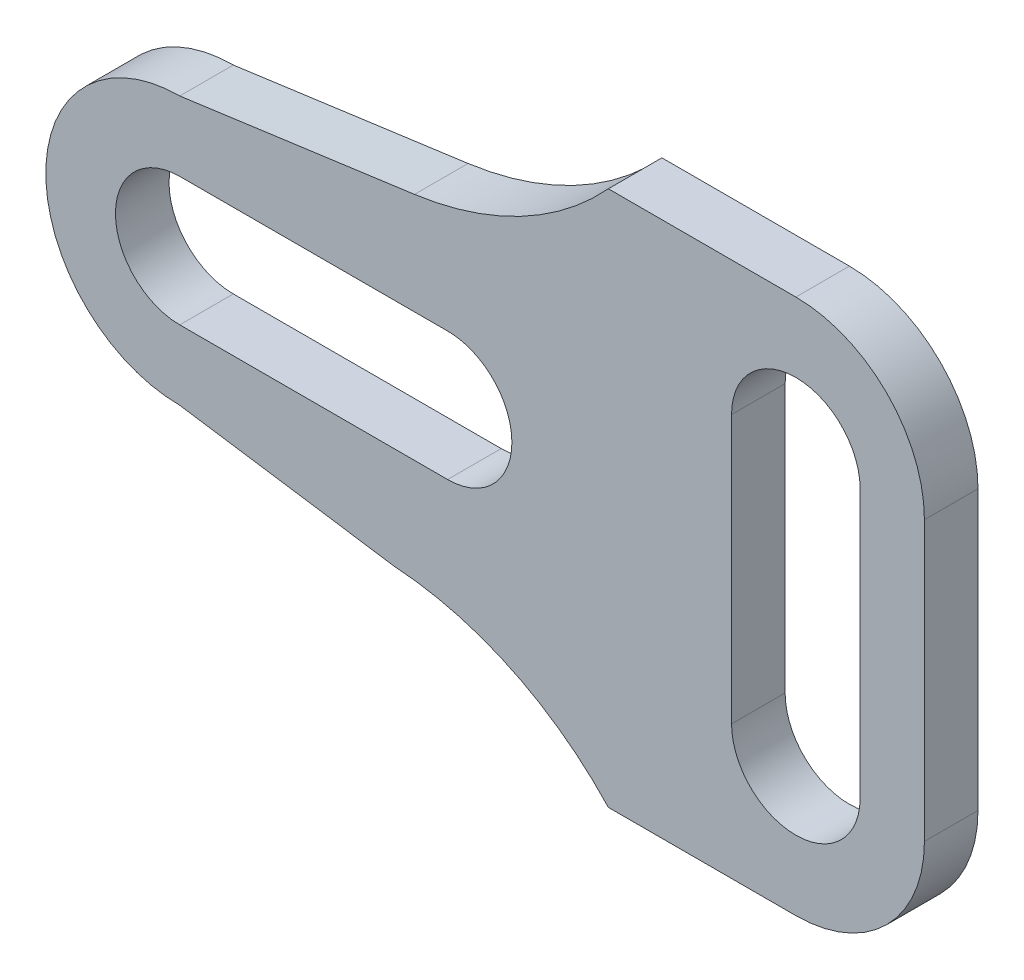
ISO-10303-21;
HEADER;
FILE_DESCRIPTION(('STEP AP214'),'2;1');
FILE_NAME('part.step','',(''),(''),'','','');
FILE_SCHEMA(('AUTOMOTIVE_DESIGN { 1 0 10303 214 1 1 1 1 }'));
ENDSEC;
DATA;
#1=APPLICATION_CONTEXT('core data for automotive mechanical design processes');
#2=APPLICATION_PROTOCOL_DEFINITION('international standard','automotive_design',2000,#1);
#3=PRODUCT_CONTEXT('',#1,'mechanical');
#4=PRODUCT('Part','Part','',(#3));
#5=PRODUCT_RELATED_PRODUCT_CATEGORY('part','',(#4));
#6=PRODUCT_DEFINITION_FORMATION('','',#4);
#7=PRODUCT_DEFINITION_CONTEXT('part definition',#1,'design');
#8=PRODUCT_DEFINITION('design','',#6,#7);
#9=PRODUCT_DEFINITION_SHAPE('','',#8);
#10=(LENGTH_UNIT() NAMED_UNIT(*) SI_UNIT(.MILLI.,.METRE.));
#11=(NAMED_UNIT(*) PLANE_ANGLE_UNIT() SI_UNIT($,.RADIAN.));
#12=(NAMED_UNIT(*) SI_UNIT($,.STERADIAN.) SOLID_ANGLE_UNIT());
#13=UNCERTAINTY_MEASURE_WITH_UNIT(LENGTH_MEASURE(1.E-05),#10,'distance_accuracy_value','');
#14=(GEOMETRIC_REPRESENTATION_CONTEXT(3) GLOBAL_UNCERTAINTY_ASSIGNED_CONTEXT((#13)) GLOBAL_UNIT_ASSIGNED_CONTEXT((#10,
#11,#12)) REPRESENTATION_CONTEXT('',''));
#15=CARTESIAN_POINT('',(0.,0.,0.));
#16=DIRECTION('',(0.,0.,1.));
#17=DIRECTION('',(1.,0.,0.));
#18=AXIS2_PLACEMENT_3D('',#15,#16,#17);
#19=CARTESIAN_POINT('',(-396.594977986043,555.770244626776,50.));
#20=DIRECTION('',(0.,0.,1.));
#21=DIRECTION('',(1.,0.,0.));
#22=AXIS2_PLACEMENT_3D('',#19,#20,#21);
#23=PLANE('',#22);
#24=CARTESIAN_POINT('',(-396.594977986043,555.770244626776,50.));
#25=DIRECTION('',(0.,0.,-1.));
#26=DIRECTION('',(1.,0.,0.));
#27=AXIS2_PLACEMENT_3D('',#24,#25,#26);
#28=CIRCLE('',#27,300.);
#29=CARTESIAN_POINT('',(-175.,353.543476538659,50.));
#30=VERTEX_POINT('',#29);
#31=CARTESIAN_POINT('',(-355.897946990004,258.543476538659,50.));
#32=VERTEX_POINT('',#31);
#33=EDGE_CURVE('E225',#30,#32,#28,.T.);
#34=ORIENTED_EDGE('',*,*,#33,.T.);
#35=DIRECTION('',(-0.990755893627058,-0.135656769986796,0.));
#36=VECTOR('',#35,1.);
#37=CARTESIAN_POINT('',(-575.,228.543476538659,50.));
#38=LINE('',#37,#36);
#39=CARTESIAN_POINT('',(-575.,228.543476538659,50.));
#40=VERTEX_POINT('',#39);
#41=EDGE_CURVE('E228',#32,#40,#38,.T.);
#42=ORIENTED_EDGE('',*,*,#41,.T.);
#43=CARTESIAN_POINT('',(-575.,103.543476538659,50.));
#44=DIRECTION('',(0.,0.,1.));
#45=DIRECTION('',(1.,0.,0.));
#46=AXIS2_PLACEMENT_3D('',#43,#44,#45);
#47=CIRCLE('',#46,125.);
#48=CARTESIAN_POINT('',(-575.,-21.4565234613415,50.));
#49=VERTEX_POINT('',#48);
#50=EDGE_CURVE('E231',#40,#49,#47,.T.);
#51=ORIENTED_EDGE('',*,*,#50,.T.);
#52=DIRECTION('',(0.988936352868298,-0.148340452930245,0.));
#53=VECTOR('',#52,1.);
#54=CARTESIAN_POINT('',(-575.,-21.4565234613415,50.));
#55=LINE('',#54,#53);
#56=CARTESIAN_POINT('',(-375.,-51.4565234613414,50.));
#57=VERTEX_POINT('',#56);
#58=EDGE_CURVE('E233',#49,#57,#55,.T.);
#59=ORIENTED_EDGE('',*,*,#58,.T.);
#60=CARTESIAN_POINT('',(-394.632050519389,-350.813471923214,50.));
#61=DIRECTION('',(0.,0.,-1.));
#62=DIRECTION('',(-1.,0.,0.));
#63=AXIS2_PLACEMENT_3D('',#60,#61,#62);
#64=CIRCLE('',#63,300.);
#65=CARTESIAN_POINT('',(-175.,-146.456523461341,50.));
#66=VERTEX_POINT('',#65);
#67=EDGE_CURVE('E235',#57,#66,#64,.T.);
#68=ORIENTED_EDGE('',*,*,#67,.T.);
#69=DIRECTION('',(1.,0.,0.));
#70=VECTOR('',#69,1.);
#71=CARTESIAN_POINT('',(0.,-146.456523461341,50.));
#72=LINE('',#71,#70);
#73=CARTESIAN_POINT('',(0.,-146.456523461341,50.));
#74=VERTEX_POINT('',#73);
#75=EDGE_CURVE('E237',#66,#74,#72,.T.);
#76=ORIENTED_EDGE('',*,*,#75,.T.);
#77=CARTESIAN_POINT('',(0.,-26.4565234613414,50.));
#78=DIRECTION('',(0.,0.,1.));
#79=DIRECTION('',(1.,0.,0.));
#80=AXIS2_PLACEMENT_3D('',#77,#78,#79);
#81=CIRCLE('',#80,120.);
#82=CARTESIAN_POINT('',(120.,-26.4565234613414,50.));
#83=VERTEX_POINT('',#82);
#84=EDGE_CURVE('E239',#74,#83,#81,.T.);
#85=ORIENTED_EDGE('',*,*,#84,.T.);
#86=DIRECTION('',(0.,1.,0.));
#87=VECTOR('',#86,1.);
#88=CARTESIAN_POINT('',(120.,233.543476538659,50.));
#89=LINE('',#88,#87);
#90=CARTESIAN_POINT('',(120.,233.543476538659,50.));
#91=VERTEX_POINT('',#90);
#92=EDGE_CURVE('E241',#83,#91,#89,.T.);
#93=ORIENTED_EDGE('',*,*,#92,.T.);
#94=CARTESIAN_POINT('',(0.,233.543476538659,50.));
#95=DIRECTION('',(0.,0.,1.));
#96=DIRECTION('',(1.,0.,0.));
#97=AXIS2_PLACEMENT_3D('',#94,#95,#96);
#98=CIRCLE('',#97,120.);
#99=CARTESIAN_POINT('',(0.,353.543476538659,50.));
#100=VERTEX_POINT('',#99);
#101=EDGE_CURVE('E243',#91,#100,#98,.T.);
#102=ORIENTED_EDGE('',*,*,#101,.T.);
#103=DIRECTION('',(-1.,0.,0.));
#104=VECTOR('',#103,1.);
#105=CARTESIAN_POINT('',(-175.,353.543476538659,50.));
#106=LINE('',#105,#104);
#107=EDGE_CURVE('E245',#100,#30,#106,.T.);
#108=ORIENTED_EDGE('',*,*,#107,.T.);
#109=EDGE_LOOP('',(#34,#42,#51,#59,#68,#76,#85,#93,#102,#108));
#110=FACE_BOUND('',#109,.T.);
#111=DIRECTION('',(0.,-1.,0.));
#112=VECTOR('',#111,1.);
#113=CARTESIAN_POINT('',(-60.0000000000001,228.543476538659,50.));
#114=LINE('',#113,#112);
#115=CARTESIAN_POINT('',(-60.0000000000001,228.543476538659,50.));
#116=VERTEX_POINT('',#115);
#117=CARTESIAN_POINT('',(-60.,-21.4565234613414,50.));
#118=VERTEX_POINT('',#117);
#119=EDGE_CURVE('E196',#116,#118,#114,.T.);
#120=ORIENTED_EDGE('',*,*,#119,.F.);
#121=CARTESIAN_POINT('',(0.,228.543476538659,50.));
#122=DIRECTION('',(0.,0.,1.));
#123=DIRECTION('',(1.,0.,0.));
#124=AXIS2_PLACEMENT_3D('',#121,#122,#123);
#125=CIRCLE('',#124,60.0000000000001);
#126=CARTESIAN_POINT('',(60.,228.543476538659,50.));
#127=VERTEX_POINT('',#126);
#128=EDGE_CURVE('E194',#127,#116,#125,.T.);
#129=ORIENTED_EDGE('',*,*,#128,.F.);
#130=DIRECTION('',(0.,1.,0.));
#131=VECTOR('',#130,1.);
#132=CARTESIAN_POINT('',(60.,228.543476538659,50.));
#133=LINE('',#132,#131);
#134=CARTESIAN_POINT('',(60.0000000000001,-21.4565234613414,50.));
#135=VERTEX_POINT('',#134);
#136=EDGE_CURVE('E202',#135,#127,#133,.T.);
#137=ORIENTED_EDGE('',*,*,#136,.F.);
#138=CARTESIAN_POINT('',(0.,-21.4565234613414,50.));
#139=DIRECTION('',(0.,0.,1.));
#140=DIRECTION('',(1.,0.,0.));
#141=AXIS2_PLACEMENT_3D('',#138,#139,#140);
#142=CIRCLE('',#141,60.);
#143=EDGE_CURVE('E199',#118,#135,#142,.T.);
#144=ORIENTED_EDGE('',*,*,#143,.F.);
#145=EDGE_LOOP('',(#120,#129,#137,#144));
#146=FACE_BOUND('',#145,.T.);
#147=DIRECTION('',(-1.,0.,0.));
#148=VECTOR('',#147,1.);
#149=CARTESIAN_POINT('',(-325.,163.543476538659,50.));
#150=LINE('',#149,#148);
#151=CARTESIAN_POINT('',(-325.,163.543476538659,50.));
#152=VERTEX_POINT('',#151);
#153=CARTESIAN_POINT('',(-575.,163.543476538659,50.));
#154=VERTEX_POINT('',#153);
#155=EDGE_CURVE('E166',#152,#154,#150,.T.);
#156=ORIENTED_EDGE('',*,*,#155,.F.);
#157=CARTESIAN_POINT('',(-325.,103.543476538659,50.));
#158=DIRECTION('',(0.,0.,1.));
#159=DIRECTION('',(1.,0.,0.));
#160=AXIS2_PLACEMENT_3D('',#157,#158,#159);
#161=CIRCLE('',#160,60.);
#162=CARTESIAN_POINT('',(-325.,43.5434765386585,50.));
#163=VERTEX_POINT('',#162);
#164=EDGE_CURVE('E158',#163,#152,#161,.T.);
#165=ORIENTED_EDGE('',*,*,#164,.F.);
#166=DIRECTION('',(1.,0.,0.));
#167=VECTOR('',#166,1.);
#168=CARTESIAN_POINT('',(-325.,43.5434765386585,50.));
#169=LINE('',#168,#167);
#170=CARTESIAN_POINT('',(-575.,43.5434765386585,50.));
#171=VERTEX_POINT('',#170);
#172=EDGE_CURVE('E180',#171,#163,#169,.T.);
#173=ORIENTED_EDGE('',*,*,#172,.F.);
#174=CARTESIAN_POINT('',(-575.,103.543476538659,50.));
#175=DIRECTION('',(0.,0.,1.));
#176=DIRECTION('',(1.,0.,0.));
#177=AXIS2_PLACEMENT_3D('',#174,#175,#176);
#178=CIRCLE('',#177,60.);
#179=EDGE_CURVE('E178',#154,#171,#178,.T.);
#180=ORIENTED_EDGE('',*,*,#179,.F.);
#181=EDGE_LOOP('',(#156,#165,#173,#180));
#182=FACE_BOUND('',#181,.T.);
#183=ADVANCED_FACE('F33',(#110,#146,#182),#23,.T.);
#184=CARTESIAN_POINT('',(-396.594977986043,555.770244626776,0.));
#185=DIRECTION('',(0.,0.,1.));
#186=DIRECTION('',(1.,0.,0.));
#187=AXIS2_PLACEMENT_3D('',#184,#185,#186);
#188=PLANE('',#187);
#189=CARTESIAN_POINT('',(0.,228.543476538659,0.));
#190=DIRECTION('',(0.,0.,1.));
#191=DIRECTION('',(1.,0.,0.));
#192=AXIS2_PLACEMENT_3D('',#189,#190,#191);
#193=CIRCLE('',#192,60.0000000000001);
#194=CARTESIAN_POINT('',(60.0000000000001,228.543476538659,0.));
#195=VERTEX_POINT('',#194);
#196=CARTESIAN_POINT('',(-60.0000000000001,228.543476538659,0.));
#197=VERTEX_POINT('',#196);
#198=EDGE_CURVE('E174',#195,#197,#193,.T.);
#199=ORIENTED_EDGE('',*,*,#198,.T.);
#200=DIRECTION('',(0.,-1.,0.));
#201=VECTOR('',#200,1.);
#202=CARTESIAN_POINT('',(-60.0000000000001,228.543476538659,0.));
#203=LINE('',#202,#201);
#204=CARTESIAN_POINT('',(-60.,-21.4565234613414,0.));
#205=VERTEX_POINT('',#204);
#206=EDGE_CURVE('E207',#197,#205,#203,.T.);
#207=ORIENTED_EDGE('',*,*,#206,.T.);
#208=CARTESIAN_POINT('',(0.,-21.4565234613414,0.));
#209=DIRECTION('',(0.,0.,1.));
#210=DIRECTION('',(1.,0.,0.));
#211=AXIS2_PLACEMENT_3D('',#208,#209,#210);
#212=CIRCLE('',#211,60.);
#213=CARTESIAN_POINT('',(60.,-21.4565234613414,0.));
#214=VERTEX_POINT('',#213);
#215=EDGE_CURVE('E210',#205,#214,#212,.T.);
#216=ORIENTED_EDGE('',*,*,#215,.T.);
#217=DIRECTION('',(0.,1.,0.));
#218=VECTOR('',#217,1.);
#219=CARTESIAN_POINT('',(60.,228.543476538659,0.));
#220=LINE('',#219,#218);
#221=EDGE_CURVE('E197',#214,#195,#220,.T.);
#222=ORIENTED_EDGE('',*,*,#221,.T.);
#223=EDGE_LOOP('',(#199,#207,#216,#222));
#224=FACE_BOUND('',#223,.T.);
#225=CARTESIAN_POINT('',(-396.594977986043,555.770244626776,0.));
#226=DIRECTION('',(0.,0.,-1.));
#227=DIRECTION('',(1.,0.,0.));
#228=AXIS2_PLACEMENT_3D('',#225,#226,#227);
#229=CIRCLE('',#228,300.);
#230=CARTESIAN_POINT('',(-175.,353.543476538659,0.));
#231=VERTEX_POINT('',#230);
#232=CARTESIAN_POINT('',(-355.897946990004,258.543476538659,0.));
#233=VERTEX_POINT('',#232);
#234=EDGE_CURVE('E224',#231,#233,#229,.T.);
#235=ORIENTED_EDGE('',*,*,#234,.F.);
#236=DIRECTION('',(-1.,0.,0.));
#237=VECTOR('',#236,1.);
#238=CARTESIAN_POINT('',(-175.,353.543476538659,0.));
#239=LINE('',#238,#237);
#240=CARTESIAN_POINT('',(0.,353.543476538659,0.));
#241=VERTEX_POINT('',#240);
#242=EDGE_CURVE('E229',#241,#231,#239,.T.);
#243=ORIENTED_EDGE('',*,*,#242,.F.);
#244=CARTESIAN_POINT('',(0.,233.543476538659,0.));
#245=DIRECTION('',(0.,0.,1.));
#246=DIRECTION('',(1.,0.,0.));
#247=AXIS2_PLACEMENT_3D('',#244,#245,#246);
#248=CIRCLE('',#247,120.);
#249=CARTESIAN_POINT('',(120.,233.543476538659,0.));
#250=VERTEX_POINT('',#249);
#251=EDGE_CURVE('E264',#250,#241,#248,.T.);
#252=ORIENTED_EDGE('',*,*,#251,.F.);
#253=DIRECTION('',(0.,1.,0.));
#254=VECTOR('',#253,1.);
#255=CARTESIAN_POINT('',(120.,233.543476538659,0.));
#256=LINE('',#255,#254);
#257=CARTESIAN_POINT('',(120.,-26.4565234613414,0.));
#258=VERTEX_POINT('',#257);
#259=EDGE_CURVE('E262',#258,#250,#256,.T.);
#260=ORIENTED_EDGE('',*,*,#259,.F.);
#261=CARTESIAN_POINT('',(0.,-26.4565234613414,0.));
#262=DIRECTION('',(0.,0.,1.));
#263=DIRECTION('',(1.,0.,0.));
#264=AXIS2_PLACEMENT_3D('',#261,#262,#263);
#265=CIRCLE('',#264,120.);
#266=CARTESIAN_POINT('',(0.,-146.456523461341,0.));
#267=VERTEX_POINT('',#266);
#268=EDGE_CURVE('E260',#267,#258,#265,.T.);
#269=ORIENTED_EDGE('',*,*,#268,.F.);
#270=DIRECTION('',(1.,0.,0.));
#271=VECTOR('',#270,1.);
#272=CARTESIAN_POINT('',(0.,-146.456523461341,0.));
#273=LINE('',#272,#271);
#274=CARTESIAN_POINT('',(-175.,-146.456523461341,0.));
#275=VERTEX_POINT('',#274);
#276=EDGE_CURVE('E258',#275,#267,#273,.T.);
#277=ORIENTED_EDGE('',*,*,#276,.F.);
#278=CARTESIAN_POINT('',(-394.632050519389,-350.813471923214,0.));
#279=DIRECTION('',(0.,0.,-1.));
#280=DIRECTION('',(-1.,0.,0.));
#281=AXIS2_PLACEMENT_3D('',#278,#279,#280);
#282=CIRCLE('',#281,300.);
#283=CARTESIAN_POINT('',(-375.,-51.4565234613414,0.));
#284=VERTEX_POINT('',#283);
#285=EDGE_CURVE('E256',#284,#275,#282,.T.);
#286=ORIENTED_EDGE('',*,*,#285,.F.);
#287=DIRECTION('',(0.988936352868298,-0.148340452930245,0.));
#288=VECTOR('',#287,1.);
#289=CARTESIAN_POINT('',(-575.,-21.4565234613415,0.));
#290=LINE('',#289,#288);
#291=CARTESIAN_POINT('',(-575.,-21.4565234613415,0.));
#292=VERTEX_POINT('',#291);
#293=EDGE_CURVE('E254',#292,#284,#290,.T.);
#294=ORIENTED_EDGE('',*,*,#293,.F.);
#295=CARTESIAN_POINT('',(-575.,103.543476538659,0.));
#296=DIRECTION('',(0.,0.,1.));
#297=DIRECTION('',(1.,0.,0.));
#298=AXIS2_PLACEMENT_3D('',#295,#296,#297);
#299=CIRCLE('',#298,125.);
#300=CARTESIAN_POINT('',(-575.,228.543476538659,0.));
#301=VERTEX_POINT('',#300);
#302=EDGE_CURVE('E252',#301,#292,#299,.T.);
#303=ORIENTED_EDGE('',*,*,#302,.F.);
#304=DIRECTION('',(-0.990755893627058,-0.135656769986796,0.));
#305=VECTOR('',#304,1.);
#306=CARTESIAN_POINT('',(-575.,228.543476538659,0.));
#307=LINE('',#306,#305);
#308=EDGE_CURVE('E250',#233,#301,#307,.T.);
#309=ORIENTED_EDGE('',*,*,#308,.F.);
#310=EDGE_LOOP('',(#235,#243,#252,#260,#269,#277,#286,#294,#303,#309));
#311=FACE_BOUND('',#310,.T.);
#312=CARTESIAN_POINT('',(-325.,103.543476538659,0.));
#313=DIRECTION('',(0.,0.,1.));
#314=DIRECTION('',(1.,0.,0.));
#315=AXIS2_PLACEMENT_3D('',#312,#313,#314);
#316=CIRCLE('',#315,60.);
#317=CARTESIAN_POINT('',(-325.,43.5434765386585,0.));
#318=VERTEX_POINT('',#317);
#319=CARTESIAN_POINT('',(-325.,163.543476538659,0.));
#320=VERTEX_POINT('',#319);
#321=EDGE_CURVE('E56',#318,#320,#316,.T.);
#322=ORIENTED_EDGE('',*,*,#321,.T.);
#323=DIRECTION('',(-1.,0.,0.));
#324=VECTOR('',#323,1.);
#325=CARTESIAN_POINT('',(-325.,163.543476538659,0.));
#326=LINE('',#325,#324);
#327=CARTESIAN_POINT('',(-575.,163.543476538659,0.));
#328=VERTEX_POINT('',#327);
#329=EDGE_CURVE('E173',#320,#328,#326,.T.);
#330=ORIENTED_EDGE('',*,*,#329,.T.);
#331=CARTESIAN_POINT('',(-575.,103.543476538659,0.));
#332=DIRECTION('',(0.,0.,1.));
#333=DIRECTION('',(1.,0.,0.));
#334=AXIS2_PLACEMENT_3D('',#331,#332,#333);
#335=CIRCLE('',#334,60.);
#336=CARTESIAN_POINT('',(-575.,43.5434765386585,0.));
#337=VERTEX_POINT('',#336);
#338=EDGE_CURVE('E186',#328,#337,#335,.T.);
#339=ORIENTED_EDGE('',*,*,#338,.T.);
#340=DIRECTION('',(1.,0.,0.));
#341=VECTOR('',#340,1.);
#342=CARTESIAN_POINT('',(-325.,43.5434765386585,0.));
#343=LINE('',#342,#341);
#344=EDGE_CURVE('E167',#337,#318,#343,.T.);
#345=ORIENTED_EDGE('',*,*,#344,.T.);
#346=EDGE_LOOP('',(#322,#330,#339,#345));
#347=FACE_BOUND('',#346,.T.);
#348=ADVANCED_FACE('F300',(#224,#311,#347),#188,.F.);
#349=CARTESIAN_POINT('',(-396.594977986043,555.770244626776,50.));
#350=DIRECTION('',(0.,0.,-1.));
#351=DIRECTION('',(-1.,0.,0.));
#352=AXIS2_PLACEMENT_3D('',#349,#350,#351);
#353=CYLINDRICAL_SURFACE('',#352,300.);
#354=ORIENTED_EDGE('',*,*,#234,.T.);
#355=DIRECTION('',(0.,0.,-1.));
#356=VECTOR('',#355,1.);
#357=CARTESIAN_POINT('',(-355.897946990004,258.543476538659,50.));
#358=LINE('',#357,#356);
#359=EDGE_CURVE('E11',#32,#233,#358,.T.);
#360=ORIENTED_EDGE('',*,*,#359,.F.);
#361=ORIENTED_EDGE('',*,*,#33,.F.);
#362=DIRECTION('',(0.,0.,-1.));
#363=VECTOR('',#362,1.);
#364=CARTESIAN_POINT('',(-175.,353.543476538659,50.));
#365=LINE('',#364,#363);
#366=EDGE_CURVE('E247',#30,#231,#365,.T.);
#367=ORIENTED_EDGE('',*,*,#366,.T.);
#368=EDGE_LOOP('',(#354,#360,#361,#367));
#369=FACE_BOUND('',#368,.T.);
#370=ADVANCED_FACE('F35',(#369),#353,.F.);
#371=CARTESIAN_POINT('',(-575.,228.543476538659,50.));
#372=DIRECTION('',(0.135656769986796,-0.990755893627058,0.));
#373=DIRECTION('',(0.990755893627058,0.135656769986796,0.));
#374=AXIS2_PLACEMENT_3D('',#371,#372,#373);
#375=PLANE('',#374);
#376=ORIENTED_EDGE('',*,*,#308,.T.);
#377=DIRECTION('',(0.,0.,-1.));
#378=VECTOR('',#377,1.);
#379=CARTESIAN_POINT('',(-575.,228.543476538659,50.));
#380=LINE('',#379,#378);
#381=EDGE_CURVE('E41',#40,#301,#380,.T.);
#382=ORIENTED_EDGE('',*,*,#381,.F.);
#383=ORIENTED_EDGE('',*,*,#41,.F.);
#384=ORIENTED_EDGE('',*,*,#359,.T.);
#385=EDGE_LOOP('',(#376,#382,#383,#384));
#386=FACE_BOUND('',#385,.T.);
#387=ADVANCED_FACE('F318',(#386),#375,.F.);
#388=CARTESIAN_POINT('',(-575.,103.543476538659,50.));
#389=DIRECTION('',(0.,0.,-1.));
#390=DIRECTION('',(-1.,0.,0.));
#391=AXIS2_PLACEMENT_3D('',#388,#389,#390);
#392=CYLINDRICAL_SURFACE('',#391,125.);
#393=ORIENTED_EDGE('',*,*,#302,.T.);
#394=DIRECTION('',(0.,0.,-1.));
#395=VECTOR('',#394,1.);
#396=CARTESIAN_POINT('',(-575.,-21.4565234613415,50.));
#397=LINE('',#396,#395);
#398=EDGE_CURVE('E287',#49,#292,#397,.T.);
#399=ORIENTED_EDGE('',*,*,#398,.F.);
#400=ORIENTED_EDGE('',*,*,#50,.F.);
#401=ORIENTED_EDGE('',*,*,#381,.T.);
#402=EDGE_LOOP('',(#393,#399,#400,#401));
#403=FACE_BOUND('',#402,.T.);
#404=ADVANCED_FACE('F294',(#403),#392,.T.);
#405=CARTESIAN_POINT('',(-575.,-21.4565234613415,50.));
#406=DIRECTION('',(0.148340452930245,0.988936352868298,0.));
#407=DIRECTION('',(-0.988936352868298,0.148340452930245,0.));
#408=AXIS2_PLACEMENT_3D('',#405,#406,#407);
#409=PLANE('',#408);
#410=ORIENTED_EDGE('',*,*,#293,.T.);
#411=DIRECTION('',(0.,0.,-1.));
#412=VECTOR('',#411,1.);
#413=CARTESIAN_POINT('',(-375.,-51.4565234613414,50.));
#414=LINE('',#413,#412);
#415=EDGE_CURVE('E284',#57,#284,#414,.T.);
#416=ORIENTED_EDGE('',*,*,#415,.F.);
#417=ORIENTED_EDGE('',*,*,#58,.F.);
#418=ORIENTED_EDGE('',*,*,#398,.T.);
#419=EDGE_LOOP('',(#410,#416,#417,#418));
#420=FACE_BOUND('',#419,.T.);
#421=ADVANCED_FACE('F306',(#420),#409,.F.);
#422=CARTESIAN_POINT('',(-394.632050519389,-350.813471923214,50.));
#423=DIRECTION('',(0.,0.,-1.));
#424=DIRECTION('',(-1.,0.,0.));
#425=AXIS2_PLACEMENT_3D('',#422,#423,#424);
#426=CYLINDRICAL_SURFACE('',#425,300.);
#427=ORIENTED_EDGE('',*,*,#285,.T.);
#428=DIRECTION('',(0.,0.,-1.));
#429=VECTOR('',#428,1.);
#430=CARTESIAN_POINT('',(-175.,-146.456523461341,50.));
#431=LINE('',#430,#429);
#432=EDGE_CURVE('E281',#66,#275,#431,.T.);
#433=ORIENTED_EDGE('',*,*,#432,.F.);
#434=ORIENTED_EDGE('',*,*,#67,.F.);
#435=ORIENTED_EDGE('',*,*,#415,.T.);
#436=EDGE_LOOP('',(#427,#433,#434,#435));
#437=FACE_BOUND('',#436,.T.);
#438=ADVANCED_FACE('F310',(#437),#426,.F.);
#439=CARTESIAN_POINT('',(0.,-146.456523461341,50.));
#440=DIRECTION('',(0.,1.,0.));
#441=DIRECTION('',(0.,0.,1.));
#442=AXIS2_PLACEMENT_3D('',#439,#440,#441);
#443=PLANE('',#442);
#444=ORIENTED_EDGE('',*,*,#276,.T.);
#445=DIRECTION('',(0.,0.,-1.));
#446=VECTOR('',#445,1.);
#447=CARTESIAN_POINT('',(0.,-146.456523461341,50.));
#448=LINE('',#447,#446);
#449=EDGE_CURVE('E278',#74,#267,#448,.T.);
#450=ORIENTED_EDGE('',*,*,#449,.F.);
#451=ORIENTED_EDGE('',*,*,#75,.F.);
#452=ORIENTED_EDGE('',*,*,#432,.T.);
#453=EDGE_LOOP('',(#444,#450,#451,#452));
#454=FACE_BOUND('',#453,.T.);
#455=ADVANCED_FACE('F341',(#454),#443,.F.);
#456=CARTESIAN_POINT('',(0.,-26.4565234613414,50.));
#457=DIRECTION('',(0.,0.,-1.));
#458=DIRECTION('',(-1.,0.,0.));
#459=AXIS2_PLACEMENT_3D('',#456,#457,#458);
#460=CYLINDRICAL_SURFACE('',#459,120.);
#461=ORIENTED_EDGE('',*,*,#268,.T.);
#462=DIRECTION('',(0.,0.,-1.));
#463=VECTOR('',#462,1.);
#464=CARTESIAN_POINT('',(120.,-26.4565234613414,50.));
#465=LINE('',#464,#463);
#466=EDGE_CURVE('E275',#83,#258,#465,.T.);
#467=ORIENTED_EDGE('',*,*,#466,.F.);
#468=ORIENTED_EDGE('',*,*,#84,.F.);
#469=ORIENTED_EDGE('',*,*,#449,.T.);
#470=EDGE_LOOP('',(#461,#467,#468,#469));
#471=FACE_BOUND('',#470,.T.);
#472=ADVANCED_FACE('F338',(#471),#460,.T.);
#473=CARTESIAN_POINT('',(120.,233.543476538659,50.));
#474=DIRECTION('',(-1.,0.,0.));
#475=DIRECTION('',(0.,0.,1.));
#476=AXIS2_PLACEMENT_3D('',#473,#474,#475);
#477=PLANE('',#476);
#478=ORIENTED_EDGE('',*,*,#259,.T.);
#479=DIRECTION('',(0.,0.,-1.));
#480=VECTOR('',#479,1.);
#481=CARTESIAN_POINT('',(120.,233.543476538659,50.));
#482=LINE('',#481,#480);
#483=EDGE_CURVE('E272',#91,#250,#482,.T.);
#484=ORIENTED_EDGE('',*,*,#483,.F.);
#485=ORIENTED_EDGE('',*,*,#92,.F.);
#486=ORIENTED_EDGE('',*,*,#466,.T.);
#487=EDGE_LOOP('',(#478,#484,#485,#486));
#488=FACE_BOUND('',#487,.T.);
#489=ADVANCED_FACE('F334',(#488),#477,.F.);
#490=CARTESIAN_POINT('',(0.,233.543476538659,50.));
#491=DIRECTION('',(0.,0.,-1.));
#492=DIRECTION('',(-1.,0.,0.));
#493=AXIS2_PLACEMENT_3D('',#490,#491,#492);
#494=CYLINDRICAL_SURFACE('',#493,120.);
#495=ORIENTED_EDGE('',*,*,#251,.T.);
#496=DIRECTION('',(0.,0.,-1.));
#497=VECTOR('',#496,1.);
#498=CARTESIAN_POINT('',(0.,353.543476538659,50.));
#499=LINE('',#498,#497);
#500=EDGE_CURVE('E269',#100,#241,#499,.T.);
#501=ORIENTED_EDGE('',*,*,#500,.F.);
#502=ORIENTED_EDGE('',*,*,#101,.F.);
#503=ORIENTED_EDGE('',*,*,#483,.T.);
#504=EDGE_LOOP('',(#495,#501,#502,#503));
#505=FACE_BOUND('',#504,.T.);
#506=ADVANCED_FACE('F330',(#505),#494,.T.);
#507=CARTESIAN_POINT('',(-175.,353.543476538659,50.));
#508=DIRECTION('',(0.,-1.,0.));
#509=DIRECTION('',(0.,0.,-1.));
#510=AXIS2_PLACEMENT_3D('',#507,#508,#509);
#511=PLANE('',#510);
#512=ORIENTED_EDGE('',*,*,#242,.T.);
#513=ORIENTED_EDGE('',*,*,#366,.F.);
#514=ORIENTED_EDGE('',*,*,#107,.F.);
#515=ORIENTED_EDGE('',*,*,#500,.T.);
#516=EDGE_LOOP('',(#512,#513,#514,#515));
#517=FACE_BOUND('',#516,.T.);
#518=ADVANCED_FACE('F325',(#517),#511,.F.);
#519=CARTESIAN_POINT('',(0.,228.543476538659,50.));
#520=DIRECTION('',(0.,0.,-1.));
#521=DIRECTION('',(-1.,0.,0.));
#522=AXIS2_PLACEMENT_3D('',#519,#520,#521);
#523=CYLINDRICAL_SURFACE('',#522,60.0000000000001);
#524=ORIENTED_EDGE('',*,*,#198,.F.);
#525=DIRECTION('',(0.,0.,-1.));
#526=VECTOR('',#525,1.);
#527=CARTESIAN_POINT('',(60.,228.543476538659,50.));
#528=LINE('',#527,#526);
#529=EDGE_CURVE('E204',#127,#195,#528,.T.);
#530=ORIENTED_EDGE('',*,*,#529,.F.);
#531=ORIENTED_EDGE('',*,*,#128,.T.);
#532=DIRECTION('',(0.,0.,-1.));
#533=VECTOR('',#532,1.);
#534=CARTESIAN_POINT('',(-60.0000000000001,228.543476538659,50.));
#535=LINE('',#534,#533);
#536=EDGE_CURVE('E221',#116,#197,#535,.T.);
#537=ORIENTED_EDGE('',*,*,#536,.T.);
#538=EDGE_LOOP('',(#524,#530,#531,#537));
#539=FACE_BOUND('',#538,.T.);
#540=ADVANCED_FACE('F358',(#539),#523,.F.);
#541=CARTESIAN_POINT('',(-60.0000000000001,228.543476538659,50.));
#542=DIRECTION('',(1.,0.,0.));
#543=DIRECTION('',(0.,1.,0.));
#544=AXIS2_PLACEMENT_3D('',#541,#542,#543);
#545=PLANE('',#544);
#546=ORIENTED_EDGE('',*,*,#206,.F.);
#547=ORIENTED_EDGE('',*,*,#536,.F.);
#548=ORIENTED_EDGE('',*,*,#119,.T.);
#549=DIRECTION('',(0.,0.,-1.));
#550=VECTOR('',#549,1.);
#551=CARTESIAN_POINT('',(-60.,-21.4565234613414,50.));
#552=LINE('',#551,#550);
#553=EDGE_CURVE('E219',#118,#205,#552,.T.);
#554=ORIENTED_EDGE('',*,*,#553,.T.);
#555=EDGE_LOOP('',(#546,#547,#548,#554));
#556=FACE_BOUND('',#555,.T.);
#557=ADVANCED_FACE('F384',(#556),#545,.T.);
#558=CARTESIAN_POINT('',(0.,-21.4565234613414,50.));
#559=DIRECTION('',(0.,0.,-1.));
#560=DIRECTION('',(-1.,0.,0.));
#561=AXIS2_PLACEMENT_3D('',#558,#559,#560);
#562=CYLINDRICAL_SURFACE('',#561,60.);
#563=ORIENTED_EDGE('',*,*,#215,.F.);
#564=ORIENTED_EDGE('',*,*,#553,.F.);
#565=ORIENTED_EDGE('',*,*,#143,.T.);
#566=DIRECTION('',(0.,0.,-1.));
#567=VECTOR('',#566,1.);
#568=CARTESIAN_POINT('',(60.,-21.4565234613414,50.));
#569=LINE('',#568,#567);
#570=EDGE_CURVE('E217',#135,#214,#569,.T.);
#571=ORIENTED_EDGE('',*,*,#570,.T.);
#572=EDGE_LOOP('',(#563,#564,#565,#571));
#573=FACE_BOUND('',#572,.T.);
#574=ADVANCED_FACE('F391',(#573),#562,.F.);
#575=CARTESIAN_POINT('',(60.,228.543476538659,50.));
#576=DIRECTION('',(-1.,0.,0.));
#577=DIRECTION('',(0.,0.,1.));
#578=AXIS2_PLACEMENT_3D('',#575,#576,#577);
#579=PLANE('',#578);
#580=ORIENTED_EDGE('',*,*,#221,.F.);
#581=ORIENTED_EDGE('',*,*,#570,.F.);
#582=ORIENTED_EDGE('',*,*,#136,.T.);
#583=ORIENTED_EDGE('',*,*,#529,.T.);
#584=EDGE_LOOP('',(#580,#581,#582,#583));
#585=FACE_BOUND('',#584,.T.);
#586=ADVANCED_FACE('F398',(#585),#579,.T.);
#587=CARTESIAN_POINT('',(-325.,103.543476538659,50.));
#588=DIRECTION('',(0.,0.,-1.));
#589=DIRECTION('',(-1.,0.,0.));
#590=AXIS2_PLACEMENT_3D('',#587,#588,#589);
#591=CYLINDRICAL_SURFACE('',#590,60.);
#592=ORIENTED_EDGE('',*,*,#321,.F.);
#593=DIRECTION('',(0.,0.,-1.));
#594=VECTOR('',#593,1.);
#595=CARTESIAN_POINT('',(-325.,43.5434765386585,50.));
#596=LINE('',#595,#594);
#597=EDGE_CURVE('E162',#163,#318,#596,.T.);
#598=ORIENTED_EDGE('',*,*,#597,.F.);
#599=ORIENTED_EDGE('',*,*,#164,.T.);
#600=DIRECTION('',(0.,0.,-1.));
#601=VECTOR('',#600,1.);
#602=CARTESIAN_POINT('',(-325.,163.543476538659,50.));
#603=LINE('',#602,#601);
#604=EDGE_CURVE('E161',#152,#320,#603,.T.);
#605=ORIENTED_EDGE('',*,*,#604,.T.);
#606=EDGE_LOOP('',(#592,#598,#599,#605));
#607=FACE_BOUND('',#606,.T.);
#608=ADVANCED_FACE('F160',(#607),#591,.F.);
#609=CARTESIAN_POINT('',(-325.,163.543476538659,50.));
#610=DIRECTION('',(0.,-1.,0.));
#611=DIRECTION('',(0.,0.,-1.));
#612=AXIS2_PLACEMENT_3D('',#609,#610,#611);
#613=PLANE('',#612);
#614=ORIENTED_EDGE('',*,*,#329,.F.);
#615=ORIENTED_EDGE('',*,*,#604,.F.);
#616=ORIENTED_EDGE('',*,*,#155,.T.);
#617=DIRECTION('',(0.,0.,-1.));
#618=VECTOR('',#617,1.);
#619=CARTESIAN_POINT('',(-575.,163.543476538659,50.));
#620=LINE('',#619,#618);
#621=EDGE_CURVE('E175',#154,#328,#620,.T.);
#622=ORIENTED_EDGE('',*,*,#621,.T.);
#623=EDGE_LOOP('',(#614,#615,#616,#622));
#624=FACE_BOUND('',#623,.T.);
#625=ADVANCED_FACE('F170',(#624),#613,.T.);
#626=CARTESIAN_POINT('',(-575.,103.543476538659,50.));
#627=DIRECTION('',(0.,0.,-1.));
#628=DIRECTION('',(-1.,0.,0.));
#629=AXIS2_PLACEMENT_3D('',#626,#627,#628);
#630=CYLINDRICAL_SURFACE('',#629,60.);
#631=ORIENTED_EDGE('',*,*,#338,.F.);
#632=ORIENTED_EDGE('',*,*,#621,.F.);
#633=ORIENTED_EDGE('',*,*,#179,.T.);
#634=DIRECTION('',(0.,0.,-1.));
#635=VECTOR('',#634,1.);
#636=CARTESIAN_POINT('',(-575.,43.5434765386585,50.));
#637=LINE('',#636,#635);
#638=EDGE_CURVE('E48',#171,#337,#637,.T.);
#639=ORIENTED_EDGE('',*,*,#638,.T.);
#640=EDGE_LOOP('',(#631,#632,#633,#639));
#641=FACE_BOUND('',#640,.T.);
#642=ADVANCED_FACE('F419',(#641),#630,.F.);
#643=CARTESIAN_POINT('',(-325.,43.5434765386585,50.));
#644=DIRECTION('',(0.,1.,0.));
#645=DIRECTION('',(0.,0.,1.));
#646=AXIS2_PLACEMENT_3D('',#643,#644,#645);
#647=PLANE('',#646);
#648=ORIENTED_EDGE('',*,*,#344,.F.);
#649=ORIENTED_EDGE('',*,*,#638,.F.);
#650=ORIENTED_EDGE('',*,*,#172,.T.);
#651=ORIENTED_EDGE('',*,*,#597,.T.);
#652=EDGE_LOOP('',(#648,#649,#650,#651));
#653=FACE_BOUND('',#652,.T.);
#654=ADVANCED_FACE('F426',(#653),#647,.T.);
#655=CLOSED_SHELL('',(#183,#348,#370,#387,#404,#421,#438,#455,#472,#489,#506,#518,#540,#557,
#574,#586,#608,#625,#642,#654));
#656=MANIFOLD_SOLID_BREP('B2',#655);
#657=ADVANCED_BREP_SHAPE_REPRESENTATION('',(#18,#656),#14);
#658=SHAPE_DEFINITION_REPRESENTATION(#9,#657);
ENDSEC;
END-ISO-10303-21;
